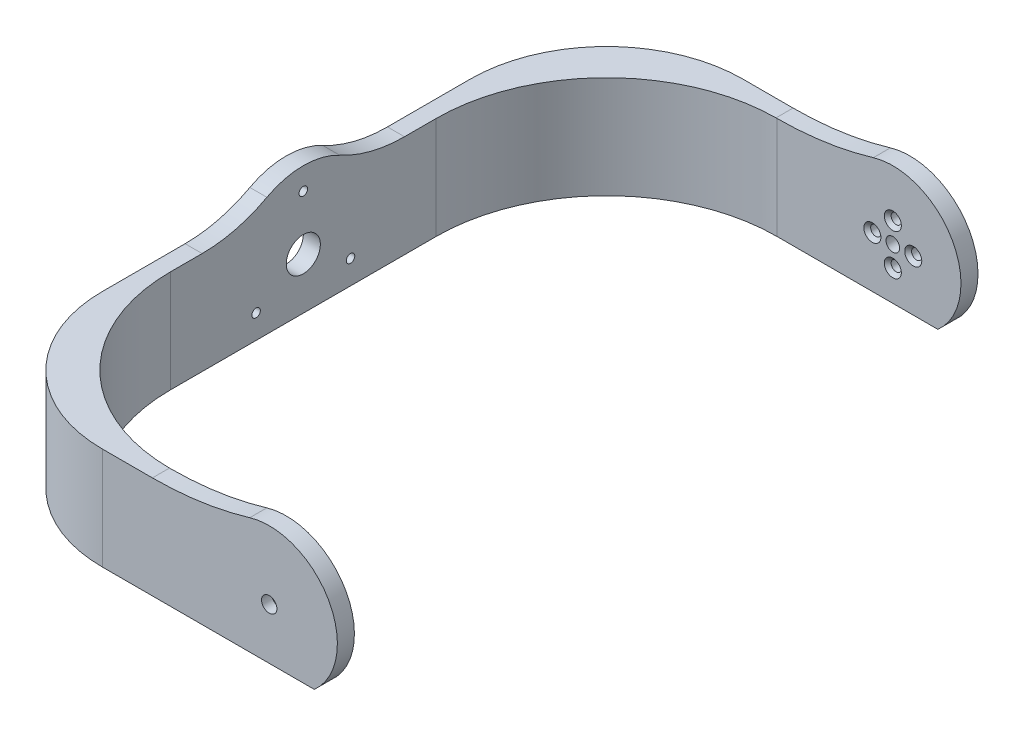
ISO-10303-21;
HEADER;
FILE_DESCRIPTION(('STEP AP214'),'2;1');
FILE_NAME('part.step','',(''),(''),'','','');
FILE_SCHEMA(('AUTOMOTIVE_DESIGN { 1 0 10303 214 1 1 1 1 }'));
ENDSEC;
DATA;
#1=APPLICATION_CONTEXT('core data for automotive mechanical design processes');
#2=APPLICATION_PROTOCOL_DEFINITION('international standard','automotive_design',2000,#1);
#3=PRODUCT_CONTEXT('',#1,'mechanical');
#4=PRODUCT('Part','Part','',(#3));
#5=PRODUCT_RELATED_PRODUCT_CATEGORY('part','',(#4));
#6=PRODUCT_DEFINITION_FORMATION('','',#4);
#7=PRODUCT_DEFINITION_CONTEXT('part definition',#1,'design');
#8=PRODUCT_DEFINITION('design','',#6,#7);
#9=PRODUCT_DEFINITION_SHAPE('','',#8);
#10=(LENGTH_UNIT() NAMED_UNIT(*) SI_UNIT(.MILLI.,.METRE.));
#11=(NAMED_UNIT(*) PLANE_ANGLE_UNIT() SI_UNIT($,.RADIAN.));
#12=(NAMED_UNIT(*) SI_UNIT($,.STERADIAN.) SOLID_ANGLE_UNIT());
#13=UNCERTAINTY_MEASURE_WITH_UNIT(LENGTH_MEASURE(1.E-05),#10,'distance_accuracy_value','');
#14=(GEOMETRIC_REPRESENTATION_CONTEXT(3) GLOBAL_UNCERTAINTY_ASSIGNED_CONTEXT((#13)) GLOBAL_UNIT_ASSIGNED_CONTEXT((#10,
#11,#12)) REPRESENTATION_CONTEXT('',''));
#15=CARTESIAN_POINT('',(0.,0.,0.));
#16=DIRECTION('',(0.,0.,1.));
#17=DIRECTION('',(1.,0.,0.));
#18=AXIS2_PLACEMENT_3D('',#15,#16,#17);
#19=CARTESIAN_POINT('',(89.,14.9999999999999,100.363961030679));
#20=DIRECTION('',(0.,0.,-1.));
#21=DIRECTION('',(0.,1.,0.));
#22=AXIS2_PLACEMENT_3D('',#19,#20,#21);
#23=CYLINDRICAL_SURFACE('',#22,2.25);
#24=CARTESIAN_POINT('',(89.,14.9999999999999,94.));
#25=DIRECTION('',(0.,0.,-1.));
#26=DIRECTION('',(-1.,0.,0.));
#27=AXIS2_PLACEMENT_3D('',#24,#25,#26);
#28=CIRCLE('',#27,2.25);
#29=CARTESIAN_POINT('',(86.75,14.9999999999999,94.));
#30=VERTEX_POINT('',#29);
#31=EDGE_CURVE('E414',#30,#30,#28,.F.);
#32=ORIENTED_EDGE('',*,*,#31,.T.);
#33=EDGE_LOOP('',(#32));
#34=FACE_BOUND('',#33,.T.);
#35=CARTESIAN_POINT('',(89.,14.9999999999999,91.));
#36=DIRECTION('',(0.,0.,-1.));
#37=DIRECTION('',(-1.,0.,0.));
#38=AXIS2_PLACEMENT_3D('',#35,#36,#37);
#39=CIRCLE('',#38,2.25);
#40=CARTESIAN_POINT('',(86.75,14.9999999999999,91.));
#41=VERTEX_POINT('',#40);
#42=EDGE_CURVE('E36',#41,#41,#39,.F.);
#43=ORIENTED_EDGE('',*,*,#42,.F.);
#44=EDGE_LOOP('',(#43));
#45=FACE_BOUND('',#44,.T.);
#46=ADVANCED_FACE('F32',(#34,#45),#23,.F.);
#47=CARTESIAN_POINT('',(0.,30.,94.));
#48=DIRECTION('',(0.,-1.,0.));
#49=DIRECTION('',(0.,0.,-1.));
#50=AXIS2_PLACEMENT_3D('',#47,#48,#49);
#51=PLANE('',#50);
#52=DIRECTION('',(0.,0.,1.));
#53=VECTOR('',#52,1.);
#54=CARTESIAN_POINT('',(5.,30.,94.));
#55=LINE('',#54,#53);
#56=CARTESIAN_POINT('',(5.,30.,29.6858552175948));
#57=VERTEX_POINT('',#56);
#58=CARTESIAN_POINT('',(5.,30.,39.));
#59=VERTEX_POINT('',#58);
#60=EDGE_CURVE('E182',#57,#59,#55,.T.);
#61=ORIENTED_EDGE('',*,*,#60,.F.);
#62=DIRECTION('',(-1.,0.,0.));
#63=VECTOR('',#62,1.);
#64=CARTESIAN_POINT('',(0.,30.,29.6858552175948));
#65=LINE('',#64,#63);
#66=CARTESIAN_POINT('',(0.,30.,29.6858552175948));
#67=VERTEX_POINT('',#66);
#68=EDGE_CURVE('E487',#57,#67,#65,.T.);
#69=ORIENTED_EDGE('',*,*,#68,.T.);
#70=DIRECTION('',(0.,0.,-1.));
#71=VECTOR('',#70,1.);
#72=CARTESIAN_POINT('',(0.,30.,94.));
#73=LINE('',#72,#71);
#74=CARTESIAN_POINT('',(0.,30.,54.));
#75=VERTEX_POINT('',#74);
#76=EDGE_CURVE('E206',#75,#67,#73,.T.);
#77=ORIENTED_EDGE('',*,*,#76,.F.);
#78=CARTESIAN_POINT('',(40.,30.,54.));
#79=DIRECTION('',(0.,-1.,0.));
#80=DIRECTION('',(0.,0.,-1.));
#81=AXIS2_PLACEMENT_3D('',#78,#79,#80);
#82=CIRCLE('',#81,40.);
#83=CARTESIAN_POINT('',(40.,30.,94.));
#84=VERTEX_POINT('',#83);
#85=EDGE_CURVE('E469',#75,#84,#82,.F.);
#86=ORIENTED_EDGE('',*,*,#85,.T.);
#87=DIRECTION('',(-1.,0.,0.));
#88=VECTOR('',#87,1.);
#89=CARTESIAN_POINT('',(0.,30.,94.));
#90=LINE('',#89,#88);
#91=CARTESIAN_POINT('',(54.7217269979948,30.,94.));
#92=VERTEX_POINT('',#91);
#93=EDGE_CURVE('E200',#92,#84,#90,.T.);
#94=ORIENTED_EDGE('',*,*,#93,.F.);
#95=DIRECTION('',(0.,0.,1.));
#96=VECTOR('',#95,1.);
#97=CARTESIAN_POINT('',(54.7217269979948,30.,89.));
#98=LINE('',#97,#96);
#99=CARTESIAN_POINT('',(54.7217269979948,30.,88.9992256353671));
#100=VERTEX_POINT('',#99);
#101=EDGE_CURVE('E222',#92,#100,#98,.F.);
#102=ORIENTED_EDGE('',*,*,#101,.T.);
#103=CARTESIAN_POINT('',(55.,30.,39.));
#104=DIRECTION('',(0.,-1.,0.));
#105=DIRECTION('',(0.,0.,-1.));
#106=AXIS2_PLACEMENT_3D('',#103,#104,#105);
#107=CIRCLE('',#106,50.);
#108=EDGE_CURVE('E279',#100,#59,#107,.T.);
#109=ORIENTED_EDGE('',*,*,#108,.T.);
#110=EDGE_LOOP('',(#61,#69,#77,#86,#94,#102,#109));
#111=FACE_BOUND('',#110,.T.);
#112=ADVANCED_FACE('F298',(#111),#51,.F.);
#113=CARTESIAN_POINT('',(0.,30.,-29.6858552175948));
#114=VERTEX_POINT('',#113);
#115=CARTESIAN_POINT('',(0.,30.,-54.));
#116=VERTEX_POINT('',#115);
#117=EDGE_CURVE('E202',#114,#116,#73,.T.);
#118=ORIENTED_EDGE('',*,*,#117,.F.);
#119=DIRECTION('',(-1.,0.,0.));
#120=VECTOR('',#119,1.);
#121=CARTESIAN_POINT('',(0.,30.,-29.6858552175948));
#122=LINE('',#121,#120);
#123=CARTESIAN_POINT('',(5.,30.,-29.6858552175948));
#124=VERTEX_POINT('',#123);
#125=EDGE_CURVE('E480',#114,#124,#122,.F.);
#126=ORIENTED_EDGE('',*,*,#125,.T.);
#127=CARTESIAN_POINT('',(5.,30.,-39.));
#128=VERTEX_POINT('',#127);
#129=EDGE_CURVE('E438',#128,#124,#55,.T.);
#130=ORIENTED_EDGE('',*,*,#129,.F.);
#131=CARTESIAN_POINT('',(55.,30.,-39.));
#132=DIRECTION('',(0.,-1.,0.));
#133=DIRECTION('',(0.,0.,-1.));
#134=AXIS2_PLACEMENT_3D('',#131,#132,#133);
#135=CIRCLE('',#134,50.);
#136=CARTESIAN_POINT('',(54.7217269979948,30.,-88.9992256353672));
#137=VERTEX_POINT('',#136);
#138=EDGE_CURVE('E245',#128,#137,#135,.T.);
#139=ORIENTED_EDGE('',*,*,#138,.T.);
#140=DIRECTION('',(0.,0.,1.));
#141=VECTOR('',#140,1.);
#142=CARTESIAN_POINT('',(54.7217269979948,30.,-94.));
#143=LINE('',#142,#141);
#144=CARTESIAN_POINT('',(54.7217269979948,30.,-94.));
#145=VERTEX_POINT('',#144);
#146=EDGE_CURVE('E220',#137,#145,#143,.F.);
#147=ORIENTED_EDGE('',*,*,#146,.T.);
#148=DIRECTION('',(-1.,0.,0.));
#149=VECTOR('',#148,1.);
#150=CARTESIAN_POINT('',(0.,30.,-94.));
#151=LINE('',#150,#149);
#152=CARTESIAN_POINT('',(40.,30.,-94.));
#153=VERTEX_POINT('',#152);
#154=EDGE_CURVE('E191',#145,#153,#151,.T.);
#155=ORIENTED_EDGE('',*,*,#154,.T.);
#156=CARTESIAN_POINT('',(40.,30.,-54.));
#157=DIRECTION('',(0.,-1.,0.));
#158=DIRECTION('',(0.,0.,-1.));
#159=AXIS2_PLACEMENT_3D('',#156,#157,#158);
#160=CIRCLE('',#159,40.);
#161=EDGE_CURVE('E468',#153,#116,#160,.F.);
#162=ORIENTED_EDGE('',*,*,#161,.T.);
#163=EDGE_LOOP('',(#118,#126,#130,#139,#147,#155,#162));
#164=FACE_BOUND('',#163,.T.);
#165=ADVANCED_FACE('F295',(#164),#51,.F.);
#166=CARTESIAN_POINT('',(0.,0.,94.));
#167=DIRECTION('',(0.,1.,0.));
#168=DIRECTION('',(0.,0.,1.));
#169=AXIS2_PLACEMENT_3D('',#166,#167,#168);
#170=PLANE('',#169);
#171=DIRECTION('',(0.,0.,-1.));
#172=VECTOR('',#171,1.);
#173=CARTESIAN_POINT('',(0.,0.,94.));
#174=LINE('',#173,#172);
#175=CARTESIAN_POINT('',(0.,0.,54.));
#176=VERTEX_POINT('',#175);
#177=CARTESIAN_POINT('',(0.,0.,-54.));
#178=VERTEX_POINT('',#177);
#179=EDGE_CURVE('E209',#176,#178,#174,.T.);
#180=ORIENTED_EDGE('',*,*,#179,.T.);
#181=CARTESIAN_POINT('',(40.,0.,-54.));
#182=DIRECTION('',(0.,1.,0.));
#183=DIRECTION('',(0.,0.,1.));
#184=AXIS2_PLACEMENT_3D('',#181,#182,#183);
#185=CIRCLE('',#184,40.);
#186=CARTESIAN_POINT('',(40.,0.,-94.));
#187=VERTEX_POINT('',#186);
#188=EDGE_CURVE('E459',#178,#187,#185,.F.);
#189=ORIENTED_EDGE('',*,*,#188,.T.);
#190=DIRECTION('',(1.,0.,0.));
#191=VECTOR('',#190,1.);
#192=CARTESIAN_POINT('',(0.,0.,-94.));
#193=LINE('',#192,#191);
#194=CARTESIAN_POINT('',(102.228756555323,0.,-94.));
#195=VERTEX_POINT('',#194);
#196=EDGE_CURVE('E188',#187,#195,#193,.T.);
#197=ORIENTED_EDGE('',*,*,#196,.T.);
#198=DIRECTION('',(0.,0.,-1.));
#199=VECTOR('',#198,1.);
#200=CARTESIAN_POINT('',(102.228756555323,0.,94.));
#201=LINE('',#200,#199);
#202=CARTESIAN_POINT('',(102.228756555323,0.,-89.));
#203=VERTEX_POINT('',#202);
#204=EDGE_CURVE('E189',#203,#195,#201,.T.);
#205=ORIENTED_EDGE('',*,*,#204,.F.);
#206=DIRECTION('',(1.,0.,0.));
#207=VECTOR('',#206,1.);
#208=CARTESIAN_POINT('',(0.,0.,-89.));
#209=LINE('',#208,#207);
#210=CARTESIAN_POINT('',(55.,0.,-89.));
#211=VERTEX_POINT('',#210);
#212=EDGE_CURVE('E183',#211,#203,#209,.T.);
#213=ORIENTED_EDGE('',*,*,#212,.F.);
#214=CARTESIAN_POINT('',(55.,0.,-39.));
#215=DIRECTION('',(0.,1.,0.));
#216=DIRECTION('',(0.,0.,1.));
#217=AXIS2_PLACEMENT_3D('',#214,#215,#216);
#218=CIRCLE('',#217,50.);
#219=CARTESIAN_POINT('',(5.,0.,-39.));
#220=VERTEX_POINT('',#219);
#221=EDGE_CURVE('E255',#211,#220,#218,.T.);
#222=ORIENTED_EDGE('',*,*,#221,.T.);
#223=DIRECTION('',(0.,0.,-1.));
#224=VECTOR('',#223,1.);
#225=CARTESIAN_POINT('',(5.,0.,94.));
#226=LINE('',#225,#224);
#227=CARTESIAN_POINT('',(5.,0.,39.));
#228=VERTEX_POINT('',#227);
#229=EDGE_CURVE('E171',#228,#220,#226,.T.);
#230=ORIENTED_EDGE('',*,*,#229,.F.);
#231=CARTESIAN_POINT('',(55.,0.,39.));
#232=DIRECTION('',(0.,1.,0.));
#233=DIRECTION('',(0.,0.,1.));
#234=AXIS2_PLACEMENT_3D('',#231,#232,#233);
#235=CIRCLE('',#234,50.);
#236=CARTESIAN_POINT('',(55.,0.,89.));
#237=VERTEX_POINT('',#236);
#238=EDGE_CURVE('E181',#228,#237,#235,.T.);
#239=ORIENTED_EDGE('',*,*,#238,.T.);
#240=DIRECTION('',(-1.,0.,0.));
#241=VECTOR('',#240,1.);
#242=CARTESIAN_POINT('',(0.,0.,89.));
#243=LINE('',#242,#241);
#244=CARTESIAN_POINT('',(102.228756555323,0.,89.));
#245=VERTEX_POINT('',#244);
#246=EDGE_CURVE('E163',#245,#237,#243,.T.);
#247=ORIENTED_EDGE('',*,*,#246,.F.);
#248=CARTESIAN_POINT('',(102.228756555323,0.,94.));
#249=VERTEX_POINT('',#248);
#250=EDGE_CURVE('E178',#249,#245,#201,.T.);
#251=ORIENTED_EDGE('',*,*,#250,.F.);
#252=DIRECTION('',(1.,0.,0.));
#253=VECTOR('',#252,1.);
#254=CARTESIAN_POINT('',(0.,0.,94.));
#255=LINE('',#254,#253);
#256=CARTESIAN_POINT('',(40.,0.,94.));
#257=VERTEX_POINT('',#256);
#258=EDGE_CURVE('E198',#257,#249,#255,.T.);
#259=ORIENTED_EDGE('',*,*,#258,.F.);
#260=CARTESIAN_POINT('',(40.,0.,54.));
#261=DIRECTION('',(0.,1.,0.));
#262=DIRECTION('',(0.,0.,1.));
#263=AXIS2_PLACEMENT_3D('',#260,#261,#262);
#264=CIRCLE('',#263,40.);
#265=EDGE_CURVE('E472',#257,#176,#264,.F.);
#266=ORIENTED_EDGE('',*,*,#265,.T.);
#267=EDGE_LOOP('',(#180,#189,#197,#205,#213,#222,#230,#239,#247,#251,#259,#266));
#268=FACE_BOUND('',#267,.T.);
#269=ADVANCED_FACE('F176',(#268),#170,.F.);
#270=CARTESIAN_POINT('',(89.,15.,94.));
#271=DIRECTION('',(0.,0.,-1.));
#272=DIRECTION('',(-1.,0.,0.));
#273=AXIS2_PLACEMENT_3D('',#270,#271,#272);
#274=CYLINDRICAL_SURFACE('',#273,20.);
#275=CARTESIAN_POINT('',(89.,15.,89.));
#276=DIRECTION('',(0.,0.,-1.));
#277=DIRECTION('',(0.,1.,0.));
#278=AXIS2_PLACEMENT_3D('',#275,#276,#277);
#279=CIRCLE('',#278,20.);
#280=CARTESIAN_POINT('',(83.2869544996658,34.1666666666667,89.));
#281=VERTEX_POINT('',#280);
#282=EDGE_CURVE('E160',#281,#245,#279,.T.);
#283=ORIENTED_EDGE('',*,*,#282,.F.);
#284=DIRECTION('',(0.,0.,-1.));
#285=VECTOR('',#284,1.);
#286=CARTESIAN_POINT('',(83.2869544996658,34.1666666666667,94.));
#287=LINE('',#286,#285);
#288=CARTESIAN_POINT('',(83.2869544996658,34.1666666666667,94.));
#289=VERTEX_POINT('',#288);
#290=EDGE_CURVE('E214',#281,#289,#287,.F.);
#291=ORIENTED_EDGE('',*,*,#290,.T.);
#292=CARTESIAN_POINT('',(89.,15.,94.));
#293=DIRECTION('',(0.,0.,1.));
#294=DIRECTION('',(1.,0.,0.));
#295=AXIS2_PLACEMENT_3D('',#292,#293,#294);
#296=CIRCLE('',#295,20.);
#297=EDGE_CURVE('E187',#249,#289,#296,.T.);
#298=ORIENTED_EDGE('',*,*,#297,.F.);
#299=ORIENTED_EDGE('',*,*,#250,.T.);
#300=EDGE_LOOP('',(#283,#291,#298,#299));
#301=FACE_BOUND('',#300,.T.);
#302=ADVANCED_FACE('F185',(#301),#274,.T.);
#303=CARTESIAN_POINT('',(89.,15.,-94.));
#304=DIRECTION('',(0.,0.,1.));
#305=DIRECTION('',(1.,0.,0.));
#306=AXIS2_PLACEMENT_3D('',#303,#304,#305);
#307=CIRCLE('',#306,20.);
#308=CARTESIAN_POINT('',(83.2869544996658,34.1666666666667,-94.));
#309=VERTEX_POINT('',#308);
#310=EDGE_CURVE('E196',#195,#309,#307,.T.);
#311=ORIENTED_EDGE('',*,*,#310,.T.);
#312=DIRECTION('',(0.,0.,-1.));
#313=VECTOR('',#312,1.);
#314=CARTESIAN_POINT('',(83.2869544996658,34.1666666666667,94.));
#315=LINE('',#314,#313);
#316=CARTESIAN_POINT('',(83.2869544996658,34.1666666666667,-89.));
#317=VERTEX_POINT('',#316);
#318=EDGE_CURVE('E224',#309,#317,#315,.F.);
#319=ORIENTED_EDGE('',*,*,#318,.T.);
#320=CARTESIAN_POINT('',(89.,15.,-89.));
#321=DIRECTION('',(0.,0.,1.));
#322=DIRECTION('',(0.,-1.,0.));
#323=AXIS2_PLACEMENT_3D('',#320,#321,#322);
#324=CIRCLE('',#323,20.);
#325=EDGE_CURVE('E172',#203,#317,#324,.T.);
#326=ORIENTED_EDGE('',*,*,#325,.F.);
#327=ORIENTED_EDGE('',*,*,#204,.T.);
#328=EDGE_LOOP('',(#311,#319,#326,#327));
#329=FACE_BOUND('',#328,.T.);
#330=ADVANCED_FACE('F291',(#329),#274,.T.);
#331=CARTESIAN_POINT('',(0.,0.,94.));
#332=DIRECTION('',(1.,0.,0.));
#333=DIRECTION('',(0.,0.,-1.));
#334=AXIS2_PLACEMENT_3D('',#331,#332,#333);
#335=PLANE('',#334);
#336=CARTESIAN_POINT('',(0.,6.99999999999982,13.856406460551));
#337=DIRECTION('',(-1.,0.,0.));
#338=DIRECTION('',(0.,0.,1.));
#339=AXIS2_PLACEMENT_3D('',#336,#337,#338);
#340=CIRCLE('',#339,1.24999999999999);
#341=CARTESIAN_POINT('',(0.,6.99999999999982,15.106406460551));
#342=VERTEX_POINT('',#341);
#343=EDGE_CURVE('E385',#342,#342,#340,.T.);
#344=ORIENTED_EDGE('',*,*,#343,.F.);
#345=EDGE_LOOP('',(#344));
#346=FACE_BOUND('',#345,.T.);
#347=CARTESIAN_POINT('',(0.,30.9999999999999,0.));
#348=DIRECTION('',(-1.,0.,0.));
#349=DIRECTION('',(0.,0.,1.));
#350=AXIS2_PLACEMENT_3D('',#347,#348,#349);
#351=CIRCLE('',#350,1.24999999999999);
#352=CARTESIAN_POINT('',(0.,30.9999999999999,1.25000000000008));
#353=VERTEX_POINT('',#352);
#354=EDGE_CURVE('E396',#353,#353,#351,.T.);
#355=ORIENTED_EDGE('',*,*,#354,.F.);
#356=EDGE_LOOP('',(#355));
#357=FACE_BOUND('',#356,.T.);
#358=CARTESIAN_POINT('',(0.,6.99999999999992,-13.856406460551));
#359=DIRECTION('',(-1.,0.,0.));
#360=DIRECTION('',(0.,0.,1.));
#361=AXIS2_PLACEMENT_3D('',#358,#359,#360);
#362=CIRCLE('',#361,1.24999999999999);
#363=CARTESIAN_POINT('',(0.,6.99999999999992,-12.606406460551));
#364=VERTEX_POINT('',#363);
#365=EDGE_CURVE('E402',#364,#364,#362,.T.);
#366=ORIENTED_EDGE('',*,*,#365,.F.);
#367=EDGE_LOOP('',(#366));
#368=FACE_BOUND('',#367,.T.);
#369=CARTESIAN_POINT('',(0.,15.,0.));
#370=DIRECTION('',(-1.,0.,0.));
#371=DIRECTION('',(0.,0.,1.));
#372=AXIS2_PLACEMENT_3D('',#369,#370,#371);
#373=CIRCLE('',#372,5.);
#374=CARTESIAN_POINT('',(0.,15.,5.));
#375=VERTEX_POINT('',#374);
#376=EDGE_CURVE('E408',#375,#375,#373,.T.);
#377=ORIENTED_EDGE('',*,*,#376,.F.);
#378=EDGE_LOOP('',(#377));
#379=FACE_BOUND('',#378,.T.);
#380=DIRECTION('',(0.,-1.,0.));
#381=VECTOR('',#380,1.);
#382=CARTESIAN_POINT('',(0.,0.,-54.));
#383=LINE('',#382,#381);
#384=EDGE_CURVE('E559',#116,#178,#383,.T.);
#385=ORIENTED_EDGE('',*,*,#384,.T.);
#386=ORIENTED_EDGE('',*,*,#179,.F.);
#387=DIRECTION('',(0.,-1.,0.));
#388=VECTOR('',#387,1.);
#389=CARTESIAN_POINT('',(0.,0.,54.));
#390=LINE('',#389,#388);
#391=EDGE_CURVE('E542',#176,#75,#390,.F.);
#392=ORIENTED_EDGE('',*,*,#391,.T.);
#393=ORIENTED_EDGE('',*,*,#76,.T.);
#394=CARTESIAN_POINT('',(0.,70.,29.6858552175948));
#395=DIRECTION('',(1.,0.,0.));
#396=DIRECTION('',(0.,0.,-1.));
#397=AXIS2_PLACEMENT_3D('',#394,#395,#396);
#398=CIRCLE('',#397,40.);
#399=CARTESIAN_POINT('',(0.,34.8,10.6869078783341));
#400=VERTEX_POINT('',#399);
#401=EDGE_CURVE('E48',#67,#400,#398,.T.);
#402=ORIENTED_EDGE('',*,*,#401,.T.);
#403=CARTESIAN_POINT('',(0.,15.,0.));
#404=DIRECTION('',(-1.,0.,0.));
#405=DIRECTION('',(0.,0.,1.));
#406=AXIS2_PLACEMENT_3D('',#403,#404,#405);
#407=CIRCLE('',#406,22.5);
#408=CARTESIAN_POINT('',(0.,34.8,-10.6869078783341));
#409=VERTEX_POINT('',#408);
#410=EDGE_CURVE('E417',#400,#409,#407,.T.);
#411=ORIENTED_EDGE('',*,*,#410,.T.);
#412=CARTESIAN_POINT('',(0.,70.,-29.6858552175948));
#413=DIRECTION('',(1.,0.,0.));
#414=DIRECTION('',(0.,0.,-1.));
#415=AXIS2_PLACEMENT_3D('',#412,#413,#414);
#416=CIRCLE('',#415,40.);
#417=EDGE_CURVE('E491',#409,#114,#416,.T.);
#418=ORIENTED_EDGE('',*,*,#417,.T.);
#419=ORIENTED_EDGE('',*,*,#117,.T.);
#420=EDGE_LOOP('',(#385,#386,#392,#393,#402,#411,#418,#419));
#421=FACE_BOUND('',#420,.T.);
#422=ADVANCED_FACE('F287',(#346,#357,#368,#379,#421),#335,.F.);
#423=CARTESIAN_POINT('',(0.,0.,94.));
#424=DIRECTION('',(0.,0.,-1.));
#425=DIRECTION('',(-1.,0.,0.));
#426=AXIS2_PLACEMENT_3D('',#423,#424,#425);
#427=PLANE('',#426);
#428=ORIENTED_EDGE('',*,*,#31,.F.);
#429=EDGE_LOOP('',(#428));
#430=FACE_BOUND('',#429,.T.);
#431=ORIENTED_EDGE('',*,*,#93,.T.);
#432=DIRECTION('',(0.,-1.,0.));
#433=VECTOR('',#432,1.);
#434=CARTESIAN_POINT('',(40.,0.,94.));
#435=LINE('',#434,#433);
#436=EDGE_CURVE('E477',#84,#257,#435,.T.);
#437=ORIENTED_EDGE('',*,*,#436,.T.);
#438=ORIENTED_EDGE('',*,*,#258,.T.);
#439=ORIENTED_EDGE('',*,*,#297,.T.);
#440=CARTESIAN_POINT('',(54.7217269979948,130.,94.));
#441=DIRECTION('',(0.,0.,-1.));
#442=DIRECTION('',(-1.,0.,0.));
#443=AXIS2_PLACEMENT_3D('',#440,#441,#442);
#444=CIRCLE('',#443,100.);
#445=EDGE_CURVE('E227',#289,#92,#444,.T.);
#446=ORIENTED_EDGE('',*,*,#445,.T.);
#447=EDGE_LOOP('',(#431,#437,#438,#439,#446));
#448=FACE_BOUND('',#447,.T.);
#449=ADVANCED_FACE('F290',(#430,#448),#427,.F.);
#450=CARTESIAN_POINT('',(0.,0.,-94.));
#451=DIRECTION('',(0.,0.,-1.));
#452=DIRECTION('',(-1.,0.,0.));
#453=AXIS2_PLACEMENT_3D('',#450,#451,#452);
#454=PLANE('',#453);
#455=CARTESIAN_POINT('',(89.0000000000001,9.00000000000001,-94.));
#456=DIRECTION('',(0.,0.,-1.));
#457=DIRECTION('',(-1.,0.,0.));
#458=AXIS2_PLACEMENT_3D('',#455,#456,#457);
#459=CIRCLE('',#458,1.5);
#460=CARTESIAN_POINT('',(87.5000000000001,9.00000000000001,-94.));
#461=VERTEX_POINT('',#460);
#462=EDGE_CURVE('E423',#461,#461,#459,.T.);
#463=ORIENTED_EDGE('',*,*,#462,.F.);
#464=EDGE_LOOP('',(#463));
#465=FACE_BOUND('',#464,.T.);
#466=CARTESIAN_POINT('',(83.,14.9999999999999,-94.));
#467=DIRECTION('',(0.,0.,-1.));
#468=DIRECTION('',(-1.,0.,0.));
#469=AXIS2_PLACEMENT_3D('',#466,#467,#468);
#470=CIRCLE('',#469,1.5);
#471=CARTESIAN_POINT('',(81.5,14.9999999999999,-94.));
#472=VERTEX_POINT('',#471);
#473=EDGE_CURVE('E426',#472,#472,#470,.T.);
#474=ORIENTED_EDGE('',*,*,#473,.F.);
#475=EDGE_LOOP('',(#474));
#476=FACE_BOUND('',#475,.T.);
#477=CARTESIAN_POINT('',(89.,21.,-94.));
#478=DIRECTION('',(0.,0.,-1.));
#479=DIRECTION('',(-1.,0.,0.));
#480=AXIS2_PLACEMENT_3D('',#477,#478,#479);
#481=CIRCLE('',#480,1.5);
#482=CARTESIAN_POINT('',(87.5,21.,-94.));
#483=VERTEX_POINT('',#482);
#484=EDGE_CURVE('E429',#483,#483,#481,.T.);
#485=ORIENTED_EDGE('',*,*,#484,.F.);
#486=EDGE_LOOP('',(#485));
#487=FACE_BOUND('',#486,.T.);
#488=CARTESIAN_POINT('',(95.,15.,-94.));
#489=DIRECTION('',(0.,0.,-1.));
#490=DIRECTION('',(-1.,0.,0.));
#491=AXIS2_PLACEMENT_3D('',#488,#489,#490);
#492=CIRCLE('',#491,1.5);
#493=CARTESIAN_POINT('',(93.5,15.,-94.));
#494=VERTEX_POINT('',#493);
#495=EDGE_CURVE('E432',#494,#494,#492,.T.);
#496=ORIENTED_EDGE('',*,*,#495,.F.);
#497=EDGE_LOOP('',(#496));
#498=FACE_BOUND('',#497,.T.);
#499=CARTESIAN_POINT('',(89.,15.,-94.));
#500=DIRECTION('',(0.,0.,-1.));
#501=DIRECTION('',(-1.,0.,0.));
#502=AXIS2_PLACEMENT_3D('',#499,#500,#501);
#503=CIRCLE('',#502,2.);
#504=CARTESIAN_POINT('',(87.,15.,-94.));
#505=VERTEX_POINT('',#504);
#506=EDGE_CURVE('E218',#505,#505,#503,.T.);
#507=ORIENTED_EDGE('',*,*,#506,.F.);
#508=EDGE_LOOP('',(#507));
#509=FACE_BOUND('',#508,.T.);
#510=ORIENTED_EDGE('',*,*,#196,.F.);
#511=DIRECTION('',(0.,-1.,0.));
#512=VECTOR('',#511,1.);
#513=CARTESIAN_POINT('',(40.,30.,-94.));
#514=LINE('',#513,#512);
#515=EDGE_CURVE('E462',#187,#153,#514,.F.);
#516=ORIENTED_EDGE('',*,*,#515,.T.);
#517=ORIENTED_EDGE('',*,*,#154,.F.);
#518=CARTESIAN_POINT('',(54.7217269979948,130.,-94.));
#519=DIRECTION('',(0.,0.,-1.));
#520=DIRECTION('',(-1.,0.,0.));
#521=AXIS2_PLACEMENT_3D('',#518,#519,#520);
#522=CIRCLE('',#521,100.);
#523=EDGE_CURVE('E233',#145,#309,#522,.F.);
#524=ORIENTED_EDGE('',*,*,#523,.T.);
#525=ORIENTED_EDGE('',*,*,#310,.F.);
#526=EDGE_LOOP('',(#510,#516,#517,#524,#525));
#527=FACE_BOUND('',#526,.T.);
#528=ADVANCED_FACE('F300',(#465,#476,#487,#498,#509,#527),#454,.T.);
#529=CARTESIAN_POINT('',(5.,0.,0.));
#530=DIRECTION('',(1.,0.,0.));
#531=DIRECTION('',(0.,0.,-1.));
#532=AXIS2_PLACEMENT_3D('',#529,#530,#531);
#533=PLANE('',#532);
#534=CARTESIAN_POINT('',(5.,6.99999999999982,13.856406460551));
#535=DIRECTION('',(1.,0.,0.));
#536=DIRECTION('',(0.,0.,-1.));
#537=AXIS2_PLACEMENT_3D('',#534,#535,#536);
#538=CIRCLE('',#537,1.24999999999999);
#539=CARTESIAN_POINT('',(5.,6.99999999999982,12.606406460551));
#540=VERTEX_POINT('',#539);
#541=EDGE_CURVE('E387',#540,#540,#538,.F.);
#542=ORIENTED_EDGE('',*,*,#541,.T.);
#543=EDGE_LOOP('',(#542));
#544=FACE_BOUND('',#543,.T.);
#545=CARTESIAN_POINT('',(5.,30.9999999999999,0.));
#546=DIRECTION('',(1.,0.,0.));
#547=DIRECTION('',(0.,0.,-1.));
#548=AXIS2_PLACEMENT_3D('',#545,#546,#547);
#549=CIRCLE('',#548,1.24999999999999);
#550=CARTESIAN_POINT('',(5.,30.9999999999999,-1.24999999999989));
#551=VERTEX_POINT('',#550);
#552=EDGE_CURVE('E399',#551,#551,#549,.F.);
#553=ORIENTED_EDGE('',*,*,#552,.T.);
#554=EDGE_LOOP('',(#553));
#555=FACE_BOUND('',#554,.T.);
#556=CARTESIAN_POINT('',(5.,6.99999999999992,-13.856406460551));
#557=DIRECTION('',(1.,0.,0.));
#558=DIRECTION('',(0.,0.,-1.));
#559=AXIS2_PLACEMENT_3D('',#556,#557,#558);
#560=CIRCLE('',#559,1.24999999999999);
#561=CARTESIAN_POINT('',(5.,6.99999999999992,-15.106406460551));
#562=VERTEX_POINT('',#561);
#563=EDGE_CURVE('E405',#562,#562,#560,.F.);
#564=ORIENTED_EDGE('',*,*,#563,.T.);
#565=EDGE_LOOP('',(#564));
#566=FACE_BOUND('',#565,.T.);
#567=CARTESIAN_POINT('',(5.,15.,0.));
#568=DIRECTION('',(1.,0.,0.));
#569=DIRECTION('',(0.,0.,-1.));
#570=AXIS2_PLACEMENT_3D('',#567,#568,#569);
#571=CIRCLE('',#570,5.);
#572=CARTESIAN_POINT('',(5.,15.,-5.));
#573=VERTEX_POINT('',#572);
#574=EDGE_CURVE('E411',#573,#573,#571,.F.);
#575=ORIENTED_EDGE('',*,*,#574,.T.);
#576=EDGE_LOOP('',(#575));
#577=FACE_BOUND('',#576,.T.);
#578=ORIENTED_EDGE('',*,*,#129,.T.);
#579=CARTESIAN_POINT('',(5.,70.,-29.6858552175948));
#580=DIRECTION('',(1.,0.,0.));
#581=DIRECTION('',(0.,0.,-1.));
#582=AXIS2_PLACEMENT_3D('',#579,#580,#581);
#583=CIRCLE('',#582,40.);
#584=CARTESIAN_POINT('',(5.,34.8,-10.6869078783341));
#585=VERTEX_POINT('',#584);
#586=EDGE_CURVE('E489',#124,#585,#583,.F.);
#587=ORIENTED_EDGE('',*,*,#586,.T.);
#588=CARTESIAN_POINT('',(5.,15.,0.));
#589=DIRECTION('',(1.,0.,0.));
#590=DIRECTION('',(0.,0.,-1.));
#591=AXIS2_PLACEMENT_3D('',#588,#589,#590);
#592=CIRCLE('',#591,22.5);
#593=CARTESIAN_POINT('',(5.,34.8,10.6869078783341));
#594=VERTEX_POINT('',#593);
#595=EDGE_CURVE('E420',#594,#585,#592,.F.);
#596=ORIENTED_EDGE('',*,*,#595,.F.);
#597=CARTESIAN_POINT('',(5.,70.,29.6858552175948));
#598=DIRECTION('',(1.,0.,0.));
#599=DIRECTION('',(0.,0.,-1.));
#600=AXIS2_PLACEMENT_3D('',#597,#598,#599);
#601=CIRCLE('',#600,40.);
#602=EDGE_CURVE('E56',#594,#57,#601,.F.);
#603=ORIENTED_EDGE('',*,*,#602,.T.);
#604=ORIENTED_EDGE('',*,*,#60,.T.);
#605=DIRECTION('',(0.,-1.,0.));
#606=VECTOR('',#605,1.);
#607=CARTESIAN_POINT('',(5.,0.,39.));
#608=LINE('',#607,#606);
#609=EDGE_CURVE('E235',#59,#228,#608,.T.);
#610=ORIENTED_EDGE('',*,*,#609,.T.);
#611=ORIENTED_EDGE('',*,*,#229,.T.);
#612=DIRECTION('',(0.,1.,0.));
#613=VECTOR('',#612,1.);
#614=CARTESIAN_POINT('',(5.,30.,-39.));
#615=LINE('',#614,#613);
#616=EDGE_CURVE('E238',#220,#128,#615,.T.);
#617=ORIENTED_EDGE('',*,*,#616,.T.);
#618=EDGE_LOOP('',(#578,#587,#596,#603,#604,#610,#611,#617));
#619=FACE_BOUND('',#618,.T.);
#620=ADVANCED_FACE('F303',(#544,#555,#566,#577,#619),#533,.T.);
#621=CARTESIAN_POINT('',(155.,55.7623622305591,89.));
#622=DIRECTION('',(0.,0.,-1.));
#623=DIRECTION('',(0.,1.,0.));
#624=AXIS2_PLACEMENT_3D('',#621,#622,#623);
#625=PLANE('',#624);
#626=CARTESIAN_POINT('',(89.,14.9999999999999,89.));
#627=DIRECTION('',(0.,0.,-1.));
#628=DIRECTION('',(-1.,0.,0.));
#629=AXIS2_PLACEMENT_3D('',#626,#627,#628);
#630=CIRCLE('',#629,4.00000000000001);
#631=CARTESIAN_POINT('',(85.,14.9999999999999,89.));
#632=VERTEX_POINT('',#631);
#633=EDGE_CURVE('E389',#632,#632,#630,.T.);
#634=ORIENTED_EDGE('',*,*,#633,.F.);
#635=EDGE_LOOP('',(#634));
#636=FACE_BOUND('',#635,.T.);
#637=ORIENTED_EDGE('',*,*,#246,.T.);
#638=DIRECTION('',(0.,-1.,0.));
#639=VECTOR('',#638,1.);
#640=CARTESIAN_POINT('',(55.,30.,89.));
#641=LINE('',#640,#639);
#642=CARTESIAN_POINT('',(55.,30.0003871800678,89.));
#643=VERTEX_POINT('',#642);
#644=EDGE_CURVE('E243',#237,#643,#641,.F.);
#645=ORIENTED_EDGE('',*,*,#644,.T.);
#646=CARTESIAN_POINT('',(54.7217269979948,130.,89.));
#647=DIRECTION('',(0.,0.,-1.));
#648=DIRECTION('',(0.,1.,0.));
#649=AXIS2_PLACEMENT_3D('',#646,#647,#648);
#650=CIRCLE('',#649,100.);
#651=EDGE_CURVE('E166',#643,#281,#650,.F.);
#652=ORIENTED_EDGE('',*,*,#651,.T.);
#653=ORIENTED_EDGE('',*,*,#282,.T.);
#654=EDGE_LOOP('',(#637,#645,#652,#653));
#655=FACE_BOUND('',#654,.T.);
#656=ADVANCED_FACE('F162',(#636,#655),#625,.T.);
#657=CARTESIAN_POINT('',(155.,55.7623622305591,-89.));
#658=DIRECTION('',(0.,0.,1.));
#659=DIRECTION('',(0.,-1.,0.));
#660=AXIS2_PLACEMENT_3D('',#657,#658,#659);
#661=PLANE('',#660);
#662=CARTESIAN_POINT('',(89.0000000000001,9.00000000000001,-89.));
#663=DIRECTION('',(0.,0.,1.));
#664=DIRECTION('',(0.,-1.,0.));
#665=AXIS2_PLACEMENT_3D('',#662,#663,#664);
#666=CIRCLE('',#665,2.49999999999995);
#667=CARTESIAN_POINT('',(89.0000000000001,6.50000000000006,-89.));
#668=VERTEX_POINT('',#667);
#669=EDGE_CURVE('E507',#668,#668,#666,.F.);
#670=ORIENTED_EDGE('',*,*,#669,.T.);
#671=EDGE_LOOP('',(#670));
#672=FACE_BOUND('',#671,.T.);
#673=CARTESIAN_POINT('',(95.,15.,-89.));
#674=DIRECTION('',(0.,0.,1.));
#675=DIRECTION('',(0.,-1.,0.));
#676=AXIS2_PLACEMENT_3D('',#673,#674,#675);
#677=CIRCLE('',#676,2.49999999999995);
#678=CARTESIAN_POINT('',(95.,12.5,-89.));
#679=VERTEX_POINT('',#678);
#680=EDGE_CURVE('E504',#679,#679,#677,.F.);
#681=ORIENTED_EDGE('',*,*,#680,.T.);
#682=EDGE_LOOP('',(#681));
#683=FACE_BOUND('',#682,.T.);
#684=CARTESIAN_POINT('',(89.,21.,-89.));
#685=DIRECTION('',(0.,0.,1.));
#686=DIRECTION('',(0.,-1.,0.));
#687=AXIS2_PLACEMENT_3D('',#684,#685,#686);
#688=CIRCLE('',#687,2.49999999999995);
#689=CARTESIAN_POINT('',(89.,18.5,-89.));
#690=VERTEX_POINT('',#689);
#691=EDGE_CURVE('E501',#690,#690,#688,.F.);
#692=ORIENTED_EDGE('',*,*,#691,.T.);
#693=EDGE_LOOP('',(#692));
#694=FACE_BOUND('',#693,.T.);
#695=CARTESIAN_POINT('',(83.,14.9999999999999,-89.));
#696=DIRECTION('',(0.,0.,1.));
#697=DIRECTION('',(0.,-1.,0.));
#698=AXIS2_PLACEMENT_3D('',#695,#696,#697);
#699=CIRCLE('',#698,2.49999999999995);
#700=CARTESIAN_POINT('',(83.,12.5,-89.));
#701=VERTEX_POINT('',#700);
#702=EDGE_CURVE('E498',#701,#701,#699,.F.);
#703=ORIENTED_EDGE('',*,*,#702,.T.);
#704=EDGE_LOOP('',(#703));
#705=FACE_BOUND('',#704,.T.);
#706=CARTESIAN_POINT('',(89.,15.,-89.));
#707=DIRECTION('',(0.,0.,1.));
#708=DIRECTION('',(0.,-1.,0.));
#709=AXIS2_PLACEMENT_3D('',#706,#707,#708);
#710=CIRCLE('',#709,2.);
#711=CARTESIAN_POINT('',(89.,13.,-89.));
#712=VERTEX_POINT('',#711);
#713=EDGE_CURVE('E215',#712,#712,#710,.T.);
#714=ORIENTED_EDGE('',*,*,#713,.F.);
#715=EDGE_LOOP('',(#714));
#716=FACE_BOUND('',#715,.T.);
#717=CARTESIAN_POINT('',(54.7217269979948,130.,-89.));
#718=DIRECTION('',(0.,0.,1.));
#719=DIRECTION('',(0.,-1.,0.));
#720=AXIS2_PLACEMENT_3D('',#717,#718,#719);
#721=CIRCLE('',#720,100.);
#722=CARTESIAN_POINT('',(55.,30.0003871800678,-89.));
#723=VERTEX_POINT('',#722);
#724=EDGE_CURVE('E230',#317,#723,#721,.F.);
#725=ORIENTED_EDGE('',*,*,#724,.T.);
#726=DIRECTION('',(0.,1.,0.));
#727=VECTOR('',#726,1.);
#728=CARTESIAN_POINT('',(55.,0.,-89.));
#729=LINE('',#728,#727);
#730=EDGE_CURVE('E241',#723,#211,#729,.F.);
#731=ORIENTED_EDGE('',*,*,#730,.T.);
#732=ORIENTED_EDGE('',*,*,#212,.T.);
#733=ORIENTED_EDGE('',*,*,#325,.T.);
#734=EDGE_LOOP('',(#725,#731,#732,#733));
#735=FACE_BOUND('',#734,.T.);
#736=ADVANCED_FACE('F312',(#672,#683,#694,#705,#716,#735),#661,.T.);
#737=CARTESIAN_POINT('',(89.,15.,-84.));
#738=DIRECTION('',(0.,0.,-1.));
#739=DIRECTION('',(-1.,0.,0.));
#740=AXIS2_PLACEMENT_3D('',#737,#738,#739);
#741=CYLINDRICAL_SURFACE('',#740,2.);
#742=ORIENTED_EDGE('',*,*,#713,.T.);
#743=EDGE_LOOP('',(#742));
#744=FACE_BOUND('',#743,.T.);
#745=ORIENTED_EDGE('',*,*,#506,.T.);
#746=EDGE_LOOP('',(#745));
#747=FACE_BOUND('',#746,.T.);
#748=ADVANCED_FACE('F316',(#744,#747),#741,.F.);
#749=CARTESIAN_POINT('',(95.,15.,-84.));
#750=DIRECTION('',(0.,0.,-1.));
#751=DIRECTION('',(-1.,0.,0.));
#752=AXIS2_PLACEMENT_3D('',#749,#750,#751);
#753=CYLINDRICAL_SURFACE('',#752,1.5);
#754=CARTESIAN_POINT('',(95.,15.,-90.));
#755=DIRECTION('',(0.,0.,1.));
#756=DIRECTION('',(1.,0.,0.));
#757=AXIS2_PLACEMENT_3D('',#754,#755,#756);
#758=CIRCLE('',#757,1.5);
#759=CARTESIAN_POINT('',(96.5,15.,-90.));
#760=VERTEX_POINT('',#759);
#761=EDGE_CURVE('E510',#760,#760,#758,.T.);
#762=ORIENTED_EDGE('',*,*,#761,.T.);
#763=EDGE_LOOP('',(#762));
#764=FACE_BOUND('',#763,.T.);
#765=ORIENTED_EDGE('',*,*,#495,.T.);
#766=EDGE_LOOP('',(#765));
#767=FACE_BOUND('',#766,.T.);
#768=ADVANCED_FACE('F323',(#764,#767),#753,.F.);
#769=CARTESIAN_POINT('',(89.,21.,-84.));
#770=DIRECTION('',(0.,0.,-1.));
#771=DIRECTION('',(-1.,0.,0.));
#772=AXIS2_PLACEMENT_3D('',#769,#770,#771);
#773=CYLINDRICAL_SURFACE('',#772,1.5);
#774=CARTESIAN_POINT('',(89.,21.,-90.));
#775=DIRECTION('',(0.,0.,1.));
#776=DIRECTION('',(1.,0.,0.));
#777=AXIS2_PLACEMENT_3D('',#774,#775,#776);
#778=CIRCLE('',#777,1.5);
#779=CARTESIAN_POINT('',(90.5,21.,-90.));
#780=VERTEX_POINT('',#779);
#781=EDGE_CURVE('E41',#780,#780,#778,.T.);
#782=ORIENTED_EDGE('',*,*,#781,.T.);
#783=EDGE_LOOP('',(#782));
#784=FACE_BOUND('',#783,.T.);
#785=ORIENTED_EDGE('',*,*,#484,.T.);
#786=EDGE_LOOP('',(#785));
#787=FACE_BOUND('',#786,.T.);
#788=ADVANCED_FACE('F327',(#784,#787),#773,.F.);
#789=CARTESIAN_POINT('',(83.,14.9999999999999,-84.));
#790=DIRECTION('',(0.,0.,-1.));
#791=DIRECTION('',(-1.,0.,0.));
#792=AXIS2_PLACEMENT_3D('',#789,#790,#791);
#793=CYLINDRICAL_SURFACE('',#792,1.5);
#794=CARTESIAN_POINT('',(83.,14.9999999999999,-90.));
#795=DIRECTION('',(0.,0.,1.));
#796=DIRECTION('',(1.,0.,0.));
#797=AXIS2_PLACEMENT_3D('',#794,#795,#796);
#798=CIRCLE('',#797,1.5);
#799=CARTESIAN_POINT('',(84.5,14.9999999999999,-90.));
#800=VERTEX_POINT('',#799);
#801=EDGE_CURVE('E11',#800,#800,#798,.T.);
#802=ORIENTED_EDGE('',*,*,#801,.T.);
#803=EDGE_LOOP('',(#802));
#804=FACE_BOUND('',#803,.T.);
#805=ORIENTED_EDGE('',*,*,#473,.T.);
#806=EDGE_LOOP('',(#805));
#807=FACE_BOUND('',#806,.T.);
#808=ADVANCED_FACE('F331',(#804,#807),#793,.F.);
#809=CARTESIAN_POINT('',(89.0000000000001,9.00000000000001,-84.));
#810=DIRECTION('',(0.,0.,-1.));
#811=DIRECTION('',(-1.,0.,0.));
#812=AXIS2_PLACEMENT_3D('',#809,#810,#811);
#813=CYLINDRICAL_SURFACE('',#812,1.5);
#814=CARTESIAN_POINT('',(89.0000000000001,9.00000000000001,-90.));
#815=DIRECTION('',(0.,0.,1.));
#816=DIRECTION('',(1.,0.,0.));
#817=AXIS2_PLACEMENT_3D('',#814,#815,#816);
#818=CIRCLE('',#817,1.5);
#819=CARTESIAN_POINT('',(90.5000000000001,9.00000000000001,-90.));
#820=VERTEX_POINT('',#819);
#821=EDGE_CURVE('E495',#820,#820,#818,.T.);
#822=ORIENTED_EDGE('',*,*,#821,.T.);
#823=EDGE_LOOP('',(#822));
#824=FACE_BOUND('',#823,.T.);
#825=ORIENTED_EDGE('',*,*,#462,.T.);
#826=EDGE_LOOP('',(#825));
#827=FACE_BOUND('',#826,.T.);
#828=ADVANCED_FACE('F285',(#824,#827),#813,.F.);
#829=CARTESIAN_POINT('',(54.7217269979948,130.,94.));
#830=DIRECTION('',(0.,0.,-1.));
#831=DIRECTION('',(-1.,0.,0.));
#832=AXIS2_PLACEMENT_3D('',#829,#830,#831);
#833=CYLINDRICAL_SURFACE('',#832,100.);
#834=ORIENTED_EDGE('',*,*,#651,.F.);
#835=CARTESIAN_POINT('',(55.,30.0003871800678,89.));
#836=CARTESIAN_POINT('',(54.953620896974,30.0002581195767,89.));
#837=CARTESIAN_POINT('',(54.9072419286273,30.0001613243255,88.9999354696139));
#838=CARTESIAN_POINT('',(54.8144842612922,30.000032264303,88.9996773480696));
#839=CARTESIAN_POINT('',(54.7681055623039,29.9999999995315,88.9994837569114));
#840=CARTESIAN_POINT('',(54.7217269979948,30.,88.9992256353671));
#841=B_SPLINE_CURVE_WITH_KNOTS('',3,(#835,#836,#837,#838,#839,#840),.UNSPECIFIED.,.F.,.F.,(4,2,
4),(0.,0.139137342743088,0.278274685486169),.UNSPECIFIED.);
#842=EDGE_CURVE('E273',#643,#100,#841,.T.);
#843=ORIENTED_EDGE('',*,*,#842,.T.);
#844=ORIENTED_EDGE('',*,*,#101,.F.);
#845=ORIENTED_EDGE('',*,*,#445,.F.);
#846=ORIENTED_EDGE('',*,*,#290,.F.);
#847=EDGE_LOOP('',(#834,#843,#844,#845,#846));
#848=FACE_BOUND('',#847,.T.);
#849=ADVANCED_FACE('F281',(#848),#833,.F.);
#850=CARTESIAN_POINT('',(54.7217269979948,130.,94.));
#851=DIRECTION('',(0.,0.,-1.));
#852=DIRECTION('',(-1.,0.,0.));
#853=AXIS2_PLACEMENT_3D('',#850,#851,#852);
#854=CYLINDRICAL_SURFACE('',#853,100.);
#855=ORIENTED_EDGE('',*,*,#523,.F.);
#856=ORIENTED_EDGE('',*,*,#146,.F.);
#857=CARTESIAN_POINT('',(54.7217269979948,30.,-88.9992256353672));
#858=CARTESIAN_POINT('',(54.7681055623039,29.9999999995315,-88.9994837569114));
#859=CARTESIAN_POINT('',(54.8144842612922,30.000032264303,-88.9996773480696));
#860=CARTESIAN_POINT('',(54.9072419286273,30.0001613243255,-88.9999354696139));
#861=CARTESIAN_POINT('',(54.953620896974,30.0002581195767,-89.));
#862=CARTESIAN_POINT('',(55.,30.0003871800678,-89.));
#863=B_SPLINE_CURVE_WITH_KNOTS('',3,(#857,#858,#859,#860,#861,#862),.UNSPECIFIED.,.F.,.F.,(4,2,
4),(0.,0.139137342743081,0.278274685486169),.UNSPECIFIED.);
#864=EDGE_CURVE('E248',#137,#723,#863,.T.);
#865=ORIENTED_EDGE('',*,*,#864,.T.);
#866=ORIENTED_EDGE('',*,*,#724,.F.);
#867=ORIENTED_EDGE('',*,*,#318,.F.);
#868=EDGE_LOOP('',(#855,#856,#865,#866,#867));
#869=FACE_BOUND('',#868,.T.);
#870=ADVANCED_FACE('F257',(#869),#854,.F.);
#871=CARTESIAN_POINT('',(55.,0.,-39.));
#872=DIRECTION('',(0.,-1.,0.));
#873=DIRECTION('',(0.,0.,-1.));
#874=AXIS2_PLACEMENT_3D('',#871,#872,#873);
#875=CYLINDRICAL_SURFACE('',#874,50.);
#876=ORIENTED_EDGE('',*,*,#221,.F.);
#877=ORIENTED_EDGE('',*,*,#730,.F.);
#878=ORIENTED_EDGE('',*,*,#864,.F.);
#879=ORIENTED_EDGE('',*,*,#138,.F.);
#880=ORIENTED_EDGE('',*,*,#616,.F.);
#881=EDGE_LOOP('',(#876,#877,#878,#879,#880));
#882=FACE_BOUND('',#881,.T.);
#883=ADVANCED_FACE('F260',(#882),#875,.F.);
#884=CARTESIAN_POINT('',(55.,0.,39.));
#885=DIRECTION('',(0.,1.,0.));
#886=DIRECTION('',(0.,0.,1.));
#887=AXIS2_PLACEMENT_3D('',#884,#885,#886);
#888=CYLINDRICAL_SURFACE('',#887,50.);
#889=ORIENTED_EDGE('',*,*,#842,.F.);
#890=ORIENTED_EDGE('',*,*,#644,.F.);
#891=ORIENTED_EDGE('',*,*,#238,.F.);
#892=ORIENTED_EDGE('',*,*,#609,.F.);
#893=ORIENTED_EDGE('',*,*,#108,.F.);
#894=EDGE_LOOP('',(#889,#890,#891,#892,#893));
#895=FACE_BOUND('',#894,.T.);
#896=ADVANCED_FACE('F264',(#895),#888,.F.);
#897=CARTESIAN_POINT('',(40.,0.,-54.));
#898=DIRECTION('',(0.,1.,0.));
#899=DIRECTION('',(0.,0.,1.));
#900=AXIS2_PLACEMENT_3D('',#897,#898,#899);
#901=CYLINDRICAL_SURFACE('',#900,40.);
#902=ORIENTED_EDGE('',*,*,#161,.F.);
#903=ORIENTED_EDGE('',*,*,#515,.F.);
#904=ORIENTED_EDGE('',*,*,#188,.F.);
#905=ORIENTED_EDGE('',*,*,#384,.F.);
#906=EDGE_LOOP('',(#902,#903,#904,#905));
#907=FACE_BOUND('',#906,.T.);
#908=ADVANCED_FACE('F269',(#907),#901,.T.);
#909=CARTESIAN_POINT('',(40.,0.,54.));
#910=DIRECTION('',(0.,-1.,0.));
#911=DIRECTION('',(0.,0.,-1.));
#912=AXIS2_PLACEMENT_3D('',#909,#910,#911);
#913=CYLINDRICAL_SURFACE('',#912,40.);
#914=ORIENTED_EDGE('',*,*,#85,.F.);
#915=ORIENTED_EDGE('',*,*,#391,.F.);
#916=ORIENTED_EDGE('',*,*,#265,.F.);
#917=ORIENTED_EDGE('',*,*,#436,.F.);
#918=EDGE_LOOP('',(#914,#915,#916,#917));
#919=FACE_BOUND('',#918,.T.);
#920=ADVANCED_FACE('F343',(#919),#913,.T.);
#921=CARTESIAN_POINT('',(63.5768725692999,15.,0.));
#922=DIRECTION('',(-1.,0.,0.));
#923=DIRECTION('',(0.,0.,1.));
#924=AXIS2_PLACEMENT_3D('',#921,#922,#923);
#925=CYLINDRICAL_SURFACE('',#924,22.5);
#926=ORIENTED_EDGE('',*,*,#595,.T.);
#927=DIRECTION('',(-1.,0.,0.));
#928=VECTOR('',#927,1.);
#929=CARTESIAN_POINT('',(63.5768725692999,34.8,-10.6869078783341));
#930=LINE('',#929,#928);
#931=EDGE_CURVE('E485',#585,#409,#930,.T.);
#932=ORIENTED_EDGE('',*,*,#931,.T.);
#933=ORIENTED_EDGE('',*,*,#410,.F.);
#934=DIRECTION('',(-1.,0.,0.));
#935=VECTOR('',#934,1.);
#936=CARTESIAN_POINT('',(63.5768725692999,34.8,10.6869078783341));
#937=LINE('',#936,#935);
#938=EDGE_CURVE('E483',#400,#594,#937,.F.);
#939=ORIENTED_EDGE('',*,*,#938,.T.);
#940=EDGE_LOOP('',(#926,#932,#933,#939));
#941=FACE_BOUND('',#940,.T.);
#942=ADVANCED_FACE('F339',(#941),#925,.T.);
#943=CARTESIAN_POINT('',(63.5768725692999,70.,-29.6858552175948));
#944=DIRECTION('',(-1.,0.,0.));
#945=DIRECTION('',(0.,0.,1.));
#946=AXIS2_PLACEMENT_3D('',#943,#944,#945);
#947=CYLINDRICAL_SURFACE('',#946,40.);
#948=ORIENTED_EDGE('',*,*,#417,.F.);
#949=ORIENTED_EDGE('',*,*,#931,.F.);
#950=ORIENTED_EDGE('',*,*,#586,.F.);
#951=ORIENTED_EDGE('',*,*,#125,.F.);
#952=EDGE_LOOP('',(#948,#949,#950,#951));
#953=FACE_BOUND('',#952,.T.);
#954=ADVANCED_FACE('F342',(#953),#947,.F.);
#955=CARTESIAN_POINT('',(63.5768725692999,70.,29.6858552175948));
#956=DIRECTION('',(-1.,0.,0.));
#957=DIRECTION('',(0.,0.,1.));
#958=AXIS2_PLACEMENT_3D('',#955,#956,#957);
#959=CYLINDRICAL_SURFACE('',#958,40.);
#960=ORIENTED_EDGE('',*,*,#602,.F.);
#961=ORIENTED_EDGE('',*,*,#938,.F.);
#962=ORIENTED_EDGE('',*,*,#401,.F.);
#963=ORIENTED_EDGE('',*,*,#68,.F.);
#964=EDGE_LOOP('',(#960,#961,#962,#963));
#965=FACE_BOUND('',#964,.T.);
#966=ADVANCED_FACE('F352',(#965),#959,.F.);
#967=CARTESIAN_POINT('',(19.142135623731,15.,0.));
#968=DIRECTION('',(-1.,0.,0.));
#969=DIRECTION('',(0.,0.,1.));
#970=AXIS2_PLACEMENT_3D('',#967,#968,#969);
#971=CYLINDRICAL_SURFACE('',#970,5.);
#972=ORIENTED_EDGE('',*,*,#376,.T.);
#973=EDGE_LOOP('',(#972));
#974=FACE_BOUND('',#973,.T.);
#975=ORIENTED_EDGE('',*,*,#574,.F.);
#976=EDGE_LOOP('',(#975));
#977=FACE_BOUND('',#976,.T.);
#978=ADVANCED_FACE('F348',(#974,#977),#971,.F.);
#979=CARTESIAN_POINT('',(19.142135623731,6.99999999999992,-13.856406460551));
#980=DIRECTION('',(-1.,0.,0.));
#981=DIRECTION('',(0.,0.,1.));
#982=AXIS2_PLACEMENT_3D('',#979,#980,#981);
#983=CYLINDRICAL_SURFACE('',#982,1.24999999999999);
#984=ORIENTED_EDGE('',*,*,#365,.T.);
#985=EDGE_LOOP('',(#984));
#986=FACE_BOUND('',#985,.T.);
#987=ORIENTED_EDGE('',*,*,#563,.F.);
#988=EDGE_LOOP('',(#987));
#989=FACE_BOUND('',#988,.T.);
#990=ADVANCED_FACE('F351',(#986,#989),#983,.F.);
#991=CARTESIAN_POINT('',(19.142135623731,30.9999999999999,0.));
#992=DIRECTION('',(-1.,0.,0.));
#993=DIRECTION('',(0.,0.,1.));
#994=AXIS2_PLACEMENT_3D('',#991,#992,#993);
#995=CYLINDRICAL_SURFACE('',#994,1.24999999999999);
#996=ORIENTED_EDGE('',*,*,#354,.T.);
#997=EDGE_LOOP('',(#996));
#998=FACE_BOUND('',#997,.T.);
#999=ORIENTED_EDGE('',*,*,#552,.F.);
#1000=EDGE_LOOP('',(#999));
#1001=FACE_BOUND('',#1000,.T.);
#1002=ADVANCED_FACE('F356',(#998,#1001),#995,.F.);
#1003=CARTESIAN_POINT('',(19.142135623731,6.99999999999982,13.856406460551));
#1004=DIRECTION('',(-1.,0.,0.));
#1005=DIRECTION('',(0.,0.,1.));
#1006=AXIS2_PLACEMENT_3D('',#1003,#1004,#1005);
#1007=CYLINDRICAL_SURFACE('',#1006,1.24999999999999);
#1008=ORIENTED_EDGE('',*,*,#343,.T.);
#1009=EDGE_LOOP('',(#1008));
#1010=FACE_BOUND('',#1009,.T.);
#1011=ORIENTED_EDGE('',*,*,#541,.F.);
#1012=EDGE_LOOP('',(#1011));
#1013=FACE_BOUND('',#1012,.T.);
#1014=ADVANCED_FACE('F360',(#1010,#1013),#1007,.F.);
#1015=CARTESIAN_POINT('',(89.0000000000001,9.00000000000001,-90.));
#1016=DIRECTION('',(0.,0.,1.));
#1017=DIRECTION('',(1.,0.,0.));
#1018=AXIS2_PLACEMENT_3D('',#1015,#1016,#1017);
#1019=CONICAL_SURFACE('',#1018,1.5,0.785398163397436);
#1020=ORIENTED_EDGE('',*,*,#669,.F.);
#1021=EDGE_LOOP('',(#1020));
#1022=FACE_BOUND('',#1021,.T.);
#1023=ORIENTED_EDGE('',*,*,#821,.F.);
#1024=EDGE_LOOP('',(#1023));
#1025=FACE_BOUND('',#1024,.T.);
#1026=ADVANCED_FACE('F364',(#1022,#1025),#1019,.F.);
#1027=CARTESIAN_POINT('',(95.,15.,-90.));
#1028=DIRECTION('',(0.,0.,1.));
#1029=DIRECTION('',(1.,0.,0.));
#1030=AXIS2_PLACEMENT_3D('',#1027,#1028,#1029);
#1031=CONICAL_SURFACE('',#1030,1.5,0.785398163397436);
#1032=ORIENTED_EDGE('',*,*,#680,.F.);
#1033=EDGE_LOOP('',(#1032));
#1034=FACE_BOUND('',#1033,.T.);
#1035=ORIENTED_EDGE('',*,*,#761,.F.);
#1036=EDGE_LOOP('',(#1035));
#1037=FACE_BOUND('',#1036,.T.);
#1038=ADVANCED_FACE('F518',(#1034,#1037),#1031,.F.);
#1039=CARTESIAN_POINT('',(89.,21.,-90.));
#1040=DIRECTION('',(0.,0.,1.));
#1041=DIRECTION('',(1.,0.,0.));
#1042=AXIS2_PLACEMENT_3D('',#1039,#1040,#1041);
#1043=CONICAL_SURFACE('',#1042,1.5,0.785398163397436);
#1044=ORIENTED_EDGE('',*,*,#691,.F.);
#1045=EDGE_LOOP('',(#1044));
#1046=FACE_BOUND('',#1045,.T.);
#1047=ORIENTED_EDGE('',*,*,#781,.F.);
#1048=EDGE_LOOP('',(#1047));
#1049=FACE_BOUND('',#1048,.T.);
#1050=ADVANCED_FACE('F376',(#1046,#1049),#1043,.F.);
#1051=CARTESIAN_POINT('',(83.,14.9999999999999,-90.));
#1052=DIRECTION('',(0.,0.,1.));
#1053=DIRECTION('',(1.,0.,0.));
#1054=AXIS2_PLACEMENT_3D('',#1051,#1052,#1053);
#1055=CONICAL_SURFACE('',#1054,1.5,0.785398163397436);
#1056=ORIENTED_EDGE('',*,*,#702,.F.);
#1057=EDGE_LOOP('',(#1056));
#1058=FACE_BOUND('',#1057,.T.);
#1059=ORIENTED_EDGE('',*,*,#801,.F.);
#1060=EDGE_LOOP('',(#1059));
#1061=FACE_BOUND('',#1060,.T.);
#1062=ADVANCED_FACE('F34',(#1058,#1061),#1055,.F.);
#1063=CARTESIAN_POINT('',(89.,14.9999999999999,91.));
#1064=DIRECTION('',(0.,0.,-1.));
#1065=DIRECTION('',(-1.,0.,0.));
#1066=AXIS2_PLACEMENT_3D('',#1063,#1064,#1065);
#1067=PLANE('',#1066);
#1068=CARTESIAN_POINT('',(89.,14.9999999999999,91.));
#1069=DIRECTION('',(0.,0.,-1.));
#1070=DIRECTION('',(-1.,0.,0.));
#1071=AXIS2_PLACEMENT_3D('',#1068,#1069,#1070);
#1072=CIRCLE('',#1071,4.00000000000001);
#1073=CARTESIAN_POINT('',(85.,14.9999999999999,91.));
#1074=VERTEX_POINT('',#1073);
#1075=EDGE_CURVE('E381',#1074,#1074,#1072,.T.);
#1076=ORIENTED_EDGE('',*,*,#1075,.T.);
#1077=EDGE_LOOP('',(#1076));
#1078=FACE_BOUND('',#1077,.T.);
#1079=ORIENTED_EDGE('',*,*,#42,.T.);
#1080=EDGE_LOOP('',(#1079));
#1081=FACE_BOUND('',#1080,.T.);
#1082=ADVANCED_FACE('F369',(#1078,#1081),#1067,.T.);
#1083=CARTESIAN_POINT('',(89.,14.9999999999999,91.));
#1084=DIRECTION('',(0.,0.,-1.));
#1085=DIRECTION('',(-1.,0.,0.));
#1086=AXIS2_PLACEMENT_3D('',#1083,#1084,#1085);
#1087=CYLINDRICAL_SURFACE('',#1086,4.00000000000001);
#1088=ORIENTED_EDGE('',*,*,#1075,.F.);
#1089=EDGE_LOOP('',(#1088));
#1090=FACE_BOUND('',#1089,.T.);
#1091=ORIENTED_EDGE('',*,*,#633,.T.);
#1092=EDGE_LOOP('',(#1091));
#1093=FACE_BOUND('',#1092,.T.);
#1094=ADVANCED_FACE('F366',(#1090,#1093),#1087,.F.);
#1095=CLOSED_SHELL('',(#46,#112,#165,#269,#302,#330,#422,#449,#528,#620,#656,#736,#748,#768,
#788,#808,#828,#849,#870,#883,#896,#908,#920,#942,#954,#966,#978,#990,#1002,#1014,#1026,#1038,
#1050,#1062,#1082,#1094));
#1096=MANIFOLD_SOLID_BREP('B2',#1095);
#1097=ADVANCED_BREP_SHAPE_REPRESENTATION('',(#18,#1096),#14);
#1098=SHAPE_DEFINITION_REPRESENTATION(#9,#1097);
ENDSEC;
END-ISO-10303-21;
